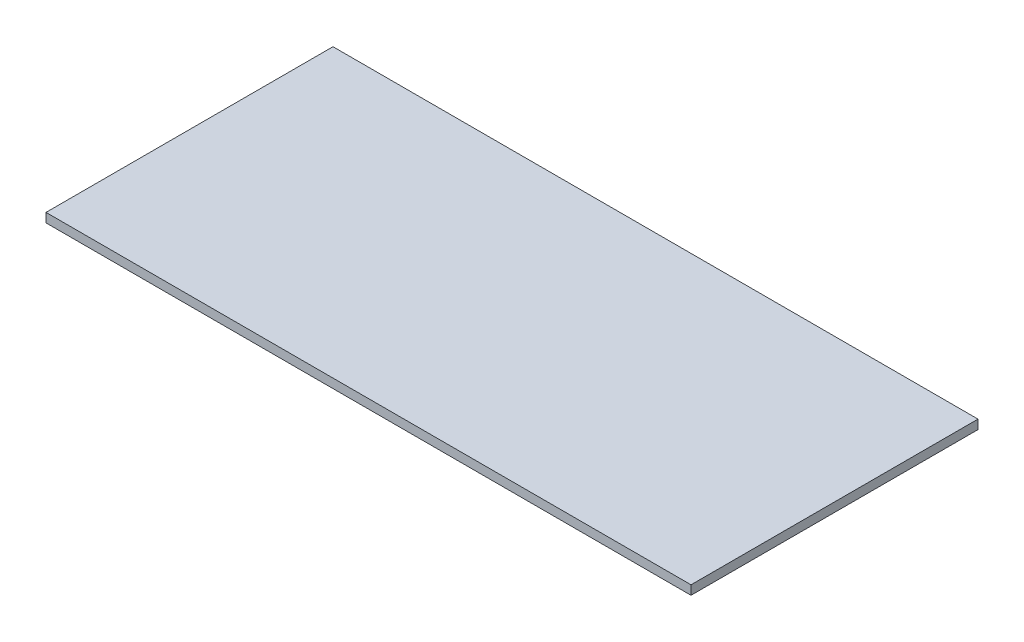
ISO-10303-21;
HEADER;
FILE_DESCRIPTION(('STEP AP214'),'2;1');
FILE_NAME('part.step','',(''),(''),'','','');
FILE_SCHEMA(('AUTOMOTIVE_DESIGN { 1 0 10303 214 1 1 1 1 }'));
ENDSEC;
DATA;
#1=APPLICATION_CONTEXT('core data for automotive mechanical design processes');
#2=APPLICATION_PROTOCOL_DEFINITION('international standard','automotive_design',2000,#1);
#3=PRODUCT_CONTEXT('',#1,'mechanical');
#4=PRODUCT('Part','Part','',(#3));
#5=PRODUCT_RELATED_PRODUCT_CATEGORY('part','',(#4));
#6=PRODUCT_DEFINITION_FORMATION('','',#4);
#7=PRODUCT_DEFINITION_CONTEXT('part definition',#1,'design');
#8=PRODUCT_DEFINITION('design','',#6,#7);
#9=PRODUCT_DEFINITION_SHAPE('','',#8);
#10=(LENGTH_UNIT() NAMED_UNIT(*) SI_UNIT(.MILLI.,.METRE.));
#11=(NAMED_UNIT(*) PLANE_ANGLE_UNIT() SI_UNIT($,.RADIAN.));
#12=(NAMED_UNIT(*) SI_UNIT($,.STERADIAN.) SOLID_ANGLE_UNIT());
#13=UNCERTAINTY_MEASURE_WITH_UNIT(LENGTH_MEASURE(1.E-05),#10,'distance_accuracy_value','');
#14=(GEOMETRIC_REPRESENTATION_CONTEXT(3) GLOBAL_UNCERTAINTY_ASSIGNED_CONTEXT((#13)) GLOBAL_UNIT_ASSIGNED_CONTEXT((#10,
#11,#12)) REPRESENTATION_CONTEXT('',''));
#15=CARTESIAN_POINT('',(0.,0.,0.));
#16=DIRECTION('',(0.,0.,1.));
#17=DIRECTION('',(1.,0.,0.));
#18=AXIS2_PLACEMENT_3D('',#15,#16,#17);
#19=CARTESIAN_POINT('',(449.58,6.35,200.025));
#20=DIRECTION('',(0.,0.,-1.));
#21=DIRECTION('',(-1.,0.,0.));
#22=AXIS2_PLACEMENT_3D('',#19,#20,#21);
#23=PLANE('',#22);
#24=DIRECTION('',(0.,-1.,0.));
#25=VECTOR('',#24,1.);
#26=CARTESIAN_POINT('',(-449.58,6.35,200.025));
#27=LINE('',#26,#25);
#28=CARTESIAN_POINT('',(-449.58,6.35,200.025));
#29=VERTEX_POINT('',#28);
#30=CARTESIAN_POINT('',(-449.58,-6.35,200.025));
#31=VERTEX_POINT('',#30);
#32=EDGE_CURVE('E105',#29,#31,#27,.T.);
#33=ORIENTED_EDGE('',*,*,#32,.T.);
#34=DIRECTION('',(-1.,0.,0.));
#35=VECTOR('',#34,1.);
#36=CARTESIAN_POINT('',(449.58,-6.35,200.025));
#37=LINE('',#36,#35);
#38=CARTESIAN_POINT('',(449.58,-6.35,200.025));
#39=VERTEX_POINT('',#38);
#40=EDGE_CURVE('E11',#39,#31,#37,.T.);
#41=ORIENTED_EDGE('',*,*,#40,.F.);
#42=DIRECTION('',(0.,-1.,0.));
#43=VECTOR('',#42,1.);
#44=CARTESIAN_POINT('',(449.58,6.35,200.025));
#45=LINE('',#44,#43);
#46=CARTESIAN_POINT('',(449.58,6.35,200.025));
#47=VERTEX_POINT('',#46);
#48=EDGE_CURVE('E93',#47,#39,#45,.T.);
#49=ORIENTED_EDGE('',*,*,#48,.F.);
#50=DIRECTION('',(-1.,0.,0.));
#51=VECTOR('',#50,1.);
#52=CARTESIAN_POINT('',(449.58,6.35,200.025));
#53=LINE('',#52,#51);
#54=EDGE_CURVE('E101',#47,#29,#53,.T.);
#55=ORIENTED_EDGE('',*,*,#54,.T.);
#56=EDGE_LOOP('',(#33,#41,#49,#55));
#57=FACE_BOUND('',#56,.T.);
#58=ADVANCED_FACE('F42',(#57),#23,.F.);
#59=CARTESIAN_POINT('',(449.58,-6.35,200.025));
#60=DIRECTION('',(0.,1.,0.));
#61=DIRECTION('',(0.,0.,1.));
#62=AXIS2_PLACEMENT_3D('',#59,#60,#61);
#63=PLANE('',#62);
#64=DIRECTION('',(0.,0.,-1.));
#65=VECTOR('',#64,1.);
#66=CARTESIAN_POINT('',(-449.58,-6.35,200.025));
#67=LINE('',#66,#65);
#68=CARTESIAN_POINT('',(-449.58,-6.35,-200.025));
#69=VERTEX_POINT('',#68);
#70=EDGE_CURVE('E97',#31,#69,#67,.T.);
#71=ORIENTED_EDGE('',*,*,#70,.T.);
#72=DIRECTION('',(-1.,0.,0.));
#73=VECTOR('',#72,1.);
#74=CARTESIAN_POINT('',(449.58,-6.35,-200.025));
#75=LINE('',#74,#73);
#76=CARTESIAN_POINT('',(449.58,-6.35,-200.025));
#77=VERTEX_POINT('',#76);
#78=EDGE_CURVE('E50',#77,#69,#75,.T.);
#79=ORIENTED_EDGE('',*,*,#78,.F.);
#80=DIRECTION('',(0.,0.,-1.));
#81=VECTOR('',#80,1.);
#82=CARTESIAN_POINT('',(449.58,-6.35,200.025));
#83=LINE('',#82,#81);
#84=EDGE_CURVE('E88',#39,#77,#83,.T.);
#85=ORIENTED_EDGE('',*,*,#84,.F.);
#86=ORIENTED_EDGE('',*,*,#40,.T.);
#87=EDGE_LOOP('',(#71,#79,#85,#86));
#88=FACE_BOUND('',#87,.T.);
#89=ADVANCED_FACE('F96',(#88),#63,.F.);
#90=CARTESIAN_POINT('',(449.58,6.35,-200.025));
#91=DIRECTION('',(0.,0.,1.));
#92=DIRECTION('',(1.,0.,0.));
#93=AXIS2_PLACEMENT_3D('',#90,#91,#92);
#94=PLANE('',#93);
#95=DIRECTION('',(0.,1.,0.));
#96=VECTOR('',#95,1.);
#97=CARTESIAN_POINT('',(-449.58,6.35,-200.025));
#98=LINE('',#97,#96);
#99=CARTESIAN_POINT('',(-449.58,6.35,-200.025));
#100=VERTEX_POINT('',#99);
#101=EDGE_CURVE('E75',#69,#100,#98,.T.);
#102=ORIENTED_EDGE('',*,*,#101,.T.);
#103=DIRECTION('',(-1.,0.,0.));
#104=VECTOR('',#103,1.);
#105=CARTESIAN_POINT('',(449.58,6.35,-200.025));
#106=LINE('',#105,#104);
#107=CARTESIAN_POINT('',(449.58,6.35,-200.025));
#108=VERTEX_POINT('',#107);
#109=EDGE_CURVE('E98',#108,#100,#106,.T.);
#110=ORIENTED_EDGE('',*,*,#109,.F.);
#111=DIRECTION('',(0.,1.,0.));
#112=VECTOR('',#111,1.);
#113=CARTESIAN_POINT('',(449.58,6.35,-200.025));
#114=LINE('',#113,#112);
#115=EDGE_CURVE('E91',#77,#108,#114,.T.);
#116=ORIENTED_EDGE('',*,*,#115,.F.);
#117=ORIENTED_EDGE('',*,*,#78,.T.);
#118=EDGE_LOOP('',(#102,#110,#116,#117));
#119=FACE_BOUND('',#118,.T.);
#120=ADVANCED_FACE('F99',(#119),#94,.F.);
#121=CARTESIAN_POINT('',(449.58,6.35,200.025));
#122=DIRECTION('',(0.,-1.,0.));
#123=DIRECTION('',(0.,0.,-1.));
#124=AXIS2_PLACEMENT_3D('',#121,#122,#123);
#125=PLANE('',#124);
#126=DIRECTION('',(0.,0.,1.));
#127=VECTOR('',#126,1.);
#128=CARTESIAN_POINT('',(-449.58,6.35,200.025));
#129=LINE('',#128,#127);
#130=EDGE_CURVE('E81',#100,#29,#129,.T.);
#131=ORIENTED_EDGE('',*,*,#130,.T.);
#132=ORIENTED_EDGE('',*,*,#54,.F.);
#133=DIRECTION('',(0.,0.,1.));
#134=VECTOR('',#133,1.);
#135=CARTESIAN_POINT('',(449.58,6.35,200.025));
#136=LINE('',#135,#134);
#137=EDGE_CURVE('E58',#108,#47,#136,.T.);
#138=ORIENTED_EDGE('',*,*,#137,.F.);
#139=ORIENTED_EDGE('',*,*,#109,.T.);
#140=EDGE_LOOP('',(#131,#132,#138,#139));
#141=FACE_BOUND('',#140,.T.);
#142=ADVANCED_FACE('F112',(#141),#125,.F.);
#143=CARTESIAN_POINT('',(449.58,0.,0.));
#144=DIRECTION('',(1.,0.,0.));
#145=DIRECTION('',(0.,0.,-1.));
#146=AXIS2_PLACEMENT_3D('',#143,#144,#145);
#147=PLANE('',#146);
#148=ORIENTED_EDGE('',*,*,#48,.T.);
#149=ORIENTED_EDGE('',*,*,#84,.T.);
#150=ORIENTED_EDGE('',*,*,#115,.T.);
#151=ORIENTED_EDGE('',*,*,#137,.T.);
#152=EDGE_LOOP('',(#148,#149,#150,#151));
#153=FACE_BOUND('',#152,.T.);
#154=ADVANCED_FACE('F89',(#153),#147,.T.);
#155=CARTESIAN_POINT('',(-449.58,0.,0.));
#156=DIRECTION('',(1.,0.,0.));
#157=DIRECTION('',(0.,0.,-1.));
#158=AXIS2_PLACEMENT_3D('',#155,#156,#157);
#159=PLANE('',#158);
#160=ORIENTED_EDGE('',*,*,#32,.F.);
#161=ORIENTED_EDGE('',*,*,#130,.F.);
#162=ORIENTED_EDGE('',*,*,#101,.F.);
#163=ORIENTED_EDGE('',*,*,#70,.F.);
#164=EDGE_LOOP('',(#160,#161,#162,#163));
#165=FACE_BOUND('',#164,.T.);
#166=ADVANCED_FACE('F115',(#165),#159,.F.);
#167=CLOSED_SHELL('',(#58,#89,#120,#142,#154,#166));
#168=MANIFOLD_SOLID_BREP('B2',#167);
#169=ADVANCED_BREP_SHAPE_REPRESENTATION('',(#18,#168),#14);
#170=SHAPE_DEFINITION_REPRESENTATION(#9,#169);
ENDSEC;
END-ISO-10303-21;
